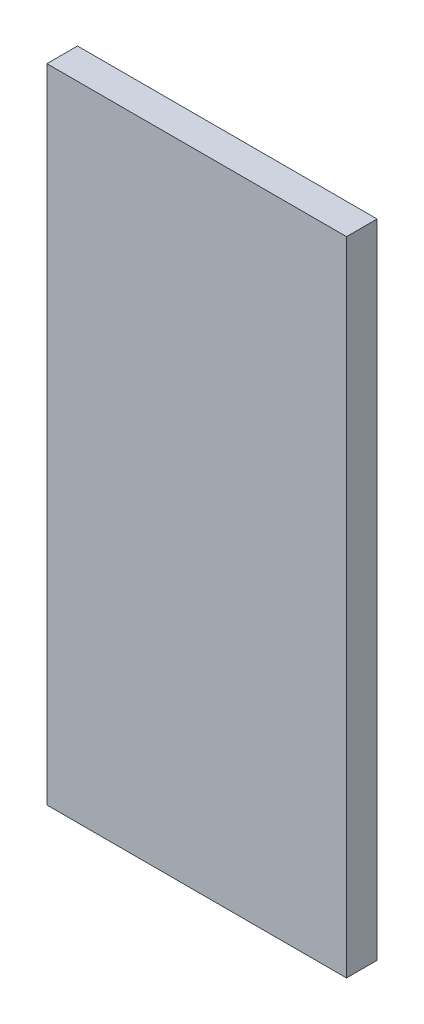
ISO-10303-21;
HEADER;
FILE_DESCRIPTION(('STEP AP214'),'2;1');
FILE_NAME('part.step','',(''),(''),'','','');
FILE_SCHEMA(('AUTOMOTIVE_DESIGN { 1 0 10303 214 1 1 1 1 }'));
ENDSEC;
DATA;
#1=APPLICATION_CONTEXT('core data for automotive mechanical design processes');
#2=APPLICATION_PROTOCOL_DEFINITION('international standard','automotive_design',2000,#1);
#3=PRODUCT_CONTEXT('',#1,'mechanical');
#4=PRODUCT('Part','Part','',(#3));
#5=PRODUCT_RELATED_PRODUCT_CATEGORY('part','',(#4));
#6=PRODUCT_DEFINITION_FORMATION('','',#4);
#7=PRODUCT_DEFINITION_CONTEXT('part definition',#1,'design');
#8=PRODUCT_DEFINITION('design','',#6,#7);
#9=PRODUCT_DEFINITION_SHAPE('','',#8);
#10=(LENGTH_UNIT() NAMED_UNIT(*) SI_UNIT(.MILLI.,.METRE.));
#11=(NAMED_UNIT(*) PLANE_ANGLE_UNIT() SI_UNIT($,.RADIAN.));
#12=(NAMED_UNIT(*) SI_UNIT($,.STERADIAN.) SOLID_ANGLE_UNIT());
#13=UNCERTAINTY_MEASURE_WITH_UNIT(LENGTH_MEASURE(1.E-05),#10,'distance_accuracy_value','');
#14=(GEOMETRIC_REPRESENTATION_CONTEXT(3) GLOBAL_UNCERTAINTY_ASSIGNED_CONTEXT((#13)) GLOBAL_UNIT_ASSIGNED_CONTEXT((#10,
#11,#12)) REPRESENTATION_CONTEXT('',''));
#15=CARTESIAN_POINT('',(0.,0.,0.));
#16=DIRECTION('',(0.,0.,1.));
#17=DIRECTION('',(1.,0.,0.));
#18=AXIS2_PLACEMENT_3D('',#15,#16,#17);
#19=CARTESIAN_POINT('',(98.,210.,20.));
#20=DIRECTION('',(-1.,0.,0.));
#21=DIRECTION('',(0.,-1.,0.));
#22=AXIS2_PLACEMENT_3D('',#19,#20,#21);
#23=PLANE('',#22);
#24=DIRECTION('',(0.,1.,0.));
#25=VECTOR('',#24,1.);
#26=CARTESIAN_POINT('',(98.,210.,0.));
#27=LINE('',#26,#25);
#28=CARTESIAN_POINT('',(98.0000000000001,-210.,0.));
#29=VERTEX_POINT('',#28);
#30=CARTESIAN_POINT('',(98.,210.,0.));
#31=VERTEX_POINT('',#30);
#32=EDGE_CURVE('E98',#29,#31,#27,.T.);
#33=ORIENTED_EDGE('',*,*,#32,.T.);
#34=DIRECTION('',(0.,0.,-1.));
#35=VECTOR('',#34,1.);
#36=CARTESIAN_POINT('',(98.,210.,20.));
#37=LINE('',#36,#35);
#38=CARTESIAN_POINT('',(98.,210.,20.));
#39=VERTEX_POINT('',#38);
#40=EDGE_CURVE('E11',#39,#31,#37,.T.);
#41=ORIENTED_EDGE('',*,*,#40,.F.);
#42=DIRECTION('',(0.,1.,0.));
#43=VECTOR('',#42,1.);
#44=CARTESIAN_POINT('',(98.,210.,20.));
#45=LINE('',#44,#43);
#46=CARTESIAN_POINT('',(98.0000000000001,-210.,20.));
#47=VERTEX_POINT('',#46);
#48=EDGE_CURVE('E86',#47,#39,#45,.T.);
#49=ORIENTED_EDGE('',*,*,#48,.F.);
#50=DIRECTION('',(0.,0.,-1.));
#51=VECTOR('',#50,1.);
#52=CARTESIAN_POINT('',(98.0000000000001,-210.,20.));
#53=LINE('',#52,#51);
#54=EDGE_CURVE('E94',#47,#29,#53,.T.);
#55=ORIENTED_EDGE('',*,*,#54,.T.);
#56=EDGE_LOOP('',(#33,#41,#49,#55));
#57=FACE_BOUND('',#56,.T.);
#58=ADVANCED_FACE('F35',(#57),#23,.F.);
#59=CARTESIAN_POINT('',(-98.,210.,20.));
#60=DIRECTION('',(0.,-1.,0.));
#61=DIRECTION('',(0.,0.,-1.));
#62=AXIS2_PLACEMENT_3D('',#59,#60,#61);
#63=PLANE('',#62);
#64=DIRECTION('',(-1.,0.,0.));
#65=VECTOR('',#64,1.);
#66=CARTESIAN_POINT('',(-98.,210.,0.));
#67=LINE('',#66,#65);
#68=CARTESIAN_POINT('',(-98.,210.,0.));
#69=VERTEX_POINT('',#68);
#70=EDGE_CURVE('E90',#31,#69,#67,.T.);
#71=ORIENTED_EDGE('',*,*,#70,.T.);
#72=DIRECTION('',(0.,0.,-1.));
#73=VECTOR('',#72,1.);
#74=CARTESIAN_POINT('',(-98.,210.,20.));
#75=LINE('',#74,#73);
#76=CARTESIAN_POINT('',(-98.,210.,20.));
#77=VERTEX_POINT('',#76);
#78=EDGE_CURVE('E43',#77,#69,#75,.T.);
#79=ORIENTED_EDGE('',*,*,#78,.F.);
#80=DIRECTION('',(-1.,0.,0.));
#81=VECTOR('',#80,1.);
#82=CARTESIAN_POINT('',(-98.,210.,20.));
#83=LINE('',#82,#81);
#84=EDGE_CURVE('E81',#39,#77,#83,.T.);
#85=ORIENTED_EDGE('',*,*,#84,.F.);
#86=ORIENTED_EDGE('',*,*,#40,.T.);
#87=EDGE_LOOP('',(#71,#79,#85,#86));
#88=FACE_BOUND('',#87,.T.);
#89=ADVANCED_FACE('F89',(#88),#63,.F.);
#90=CARTESIAN_POINT('',(-98.,210.,20.));
#91=DIRECTION('',(1.,0.,0.));
#92=DIRECTION('',(0.,1.,0.));
#93=AXIS2_PLACEMENT_3D('',#90,#91,#92);
#94=PLANE('',#93);
#95=DIRECTION('',(0.,-1.,0.));
#96=VECTOR('',#95,1.);
#97=CARTESIAN_POINT('',(-98.,210.,0.));
#98=LINE('',#97,#96);
#99=CARTESIAN_POINT('',(-98.,-210.,0.));
#100=VERTEX_POINT('',#99);
#101=EDGE_CURVE('E68',#69,#100,#98,.T.);
#102=ORIENTED_EDGE('',*,*,#101,.T.);
#103=DIRECTION('',(0.,0.,-1.));
#104=VECTOR('',#103,1.);
#105=CARTESIAN_POINT('',(-98.,-210.,20.));
#106=LINE('',#105,#104);
#107=CARTESIAN_POINT('',(-98.,-210.,20.));
#108=VERTEX_POINT('',#107);
#109=EDGE_CURVE('E91',#108,#100,#106,.T.);
#110=ORIENTED_EDGE('',*,*,#109,.F.);
#111=DIRECTION('',(0.,-1.,0.));
#112=VECTOR('',#111,1.);
#113=CARTESIAN_POINT('',(-98.,210.,20.));
#114=LINE('',#113,#112);
#115=EDGE_CURVE('E84',#77,#108,#114,.T.);
#116=ORIENTED_EDGE('',*,*,#115,.F.);
#117=ORIENTED_EDGE('',*,*,#78,.T.);
#118=EDGE_LOOP('',(#102,#110,#116,#117));
#119=FACE_BOUND('',#118,.T.);
#120=ADVANCED_FACE('F92',(#119),#94,.F.);
#121=CARTESIAN_POINT('',(-98.,-210.,20.));
#122=DIRECTION('',(0.,1.,0.));
#123=DIRECTION('',(0.,0.,1.));
#124=AXIS2_PLACEMENT_3D('',#121,#122,#123);
#125=PLANE('',#124);
#126=DIRECTION('',(1.,0.,0.));
#127=VECTOR('',#126,1.);
#128=CARTESIAN_POINT('',(-98.,-210.,0.));
#129=LINE('',#128,#127);
#130=EDGE_CURVE('E74',#100,#29,#129,.T.);
#131=ORIENTED_EDGE('',*,*,#130,.T.);
#132=ORIENTED_EDGE('',*,*,#54,.F.);
#133=DIRECTION('',(1.,0.,0.));
#134=VECTOR('',#133,1.);
#135=CARTESIAN_POINT('',(-98.,-210.,20.));
#136=LINE('',#135,#134);
#137=EDGE_CURVE('E51',#108,#47,#136,.T.);
#138=ORIENTED_EDGE('',*,*,#137,.F.);
#139=ORIENTED_EDGE('',*,*,#109,.T.);
#140=EDGE_LOOP('',(#131,#132,#138,#139));
#141=FACE_BOUND('',#140,.T.);
#142=ADVANCED_FACE('F105',(#141),#125,.F.);
#143=CARTESIAN_POINT('',(0.,0.,20.));
#144=DIRECTION('',(0.,0.,1.));
#145=DIRECTION('',(1.,0.,0.));
#146=AXIS2_PLACEMENT_3D('',#143,#144,#145);
#147=PLANE('',#146);
#148=ORIENTED_EDGE('',*,*,#48,.T.);
#149=ORIENTED_EDGE('',*,*,#84,.T.);
#150=ORIENTED_EDGE('',*,*,#115,.T.);
#151=ORIENTED_EDGE('',*,*,#137,.T.);
#152=EDGE_LOOP('',(#148,#149,#150,#151));
#153=FACE_BOUND('',#152,.T.);
#154=ADVANCED_FACE('F82',(#153),#147,.T.);
#155=CARTESIAN_POINT('',(0.,0.,0.));
#156=DIRECTION('',(0.,0.,1.));
#157=DIRECTION('',(1.,0.,0.));
#158=AXIS2_PLACEMENT_3D('',#155,#156,#157);
#159=PLANE('',#158);
#160=ORIENTED_EDGE('',*,*,#32,.F.);
#161=ORIENTED_EDGE('',*,*,#130,.F.);
#162=ORIENTED_EDGE('',*,*,#101,.F.);
#163=ORIENTED_EDGE('',*,*,#70,.F.);
#164=EDGE_LOOP('',(#160,#161,#162,#163));
#165=FACE_BOUND('',#164,.T.);
#166=ADVANCED_FACE('F108',(#165),#159,.F.);
#167=CLOSED_SHELL('',(#58,#89,#120,#142,#154,#166));
#168=MANIFOLD_SOLID_BREP('B2',#167);
#169=ADVANCED_BREP_SHAPE_REPRESENTATION('',(#18,#168),#14);
#170=SHAPE_DEFINITION_REPRESENTATION(#9,#169);
ENDSEC;
END-ISO-10303-21;
